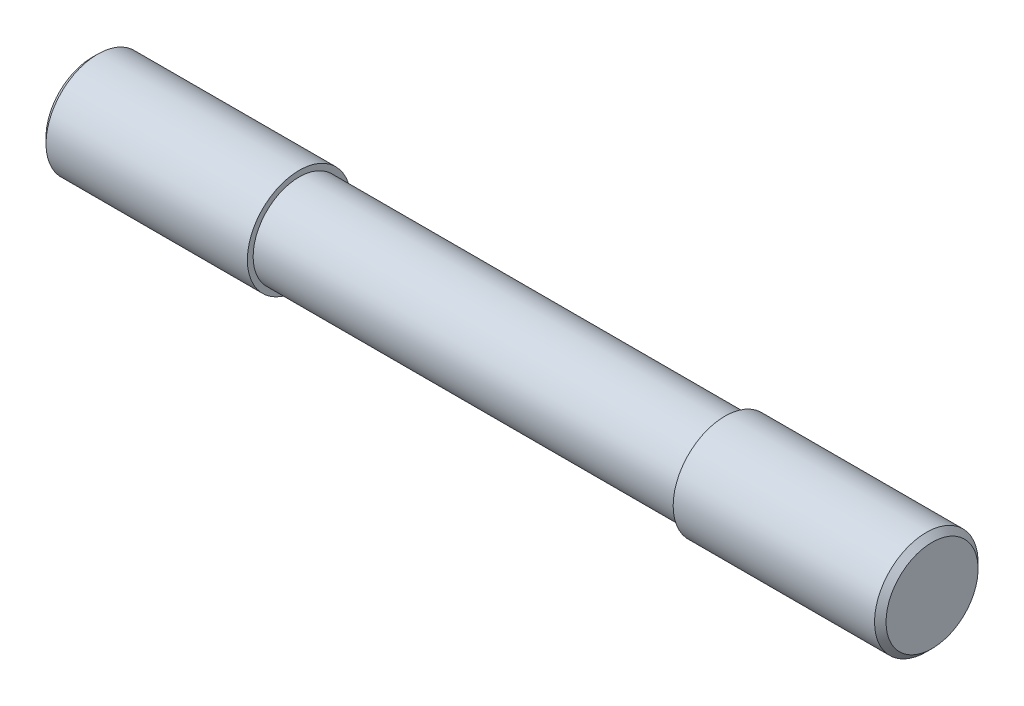
ISO-10303-21;
HEADER;
FILE_DESCRIPTION(('STEP AP214'),'2;1');
FILE_NAME('part.step','',(''),(''),'','','');
FILE_SCHEMA(('AUTOMOTIVE_DESIGN { 1 0 10303 214 1 1 1 1 }'));
ENDSEC;
DATA;
#1=APPLICATION_CONTEXT('core data for automotive mechanical design processes');
#2=APPLICATION_PROTOCOL_DEFINITION('international standard','automotive_design',2000,#1);
#3=PRODUCT_CONTEXT('',#1,'mechanical');
#4=PRODUCT('Part','Part','',(#3));
#5=PRODUCT_RELATED_PRODUCT_CATEGORY('part','',(#4));
#6=PRODUCT_DEFINITION_FORMATION('','',#4);
#7=PRODUCT_DEFINITION_CONTEXT('part definition',#1,'design');
#8=PRODUCT_DEFINITION('design','',#6,#7);
#9=PRODUCT_DEFINITION_SHAPE('','',#8);
#10=(LENGTH_UNIT() NAMED_UNIT(*) SI_UNIT(.MILLI.,.METRE.));
#11=(NAMED_UNIT(*) PLANE_ANGLE_UNIT() SI_UNIT($,.RADIAN.));
#12=(NAMED_UNIT(*) SI_UNIT($,.STERADIAN.) SOLID_ANGLE_UNIT());
#13=UNCERTAINTY_MEASURE_WITH_UNIT(LENGTH_MEASURE(1.E-05),#10,'distance_accuracy_value','');
#14=(GEOMETRIC_REPRESENTATION_CONTEXT(3) GLOBAL_UNCERTAINTY_ASSIGNED_CONTEXT((#13)) GLOBAL_UNIT_ASSIGNED_CONTEXT((#10,
#11,#12)) REPRESENTATION_CONTEXT('',''));
#15=CARTESIAN_POINT('',(0.,0.,0.));
#16=DIRECTION('',(0.,0.,1.));
#17=DIRECTION('',(1.,0.,0.));
#18=AXIS2_PLACEMENT_3D('',#15,#16,#17);
#19=CARTESIAN_POINT('',(365.,0.,0.));
#20=DIRECTION('',(-1.,0.,0.));
#21=DIRECTION('',(0.,0.,1.));
#22=AXIS2_PLACEMENT_3D('',#19,#20,#21);
#23=PLANE('',#22);
#24=CARTESIAN_POINT('',(365.,0.,0.));
#25=DIRECTION('',(-1.,0.,0.));
#26=DIRECTION('',(0.,0.,1.));
#27=AXIS2_PLACEMENT_3D('',#24,#25,#26);
#28=CIRCLE('',#27,19.9999999999999);
#29=CARTESIAN_POINT('',(365.,0.,19.9999999999999));
#30=VERTEX_POINT('',#29);
#31=EDGE_CURVE('E10',#30,#30,#28,.F.);
#32=ORIENTED_EDGE('',*,*,#31,.T.);
#33=EDGE_LOOP('',(#32));
#34=FACE_BOUND('',#33,.T.);
#35=ADVANCED_FACE('F31',(#34),#23,.F.);
#36=CARTESIAN_POINT('',(-60.5841836734694,0.,0.));
#37=DIRECTION('',(-1.,0.,0.));
#38=DIRECTION('',(0.,0.,1.));
#39=AXIS2_PLACEMENT_3D('',#36,#37,#38);
#40=CYLINDRICAL_SURFACE('',#39,22.5);
#41=CARTESIAN_POINT('',(362.5,0.,0.));
#42=DIRECTION('',(-1.,0.,0.));
#43=DIRECTION('',(0.,0.,1.));
#44=AXIS2_PLACEMENT_3D('',#41,#42,#43);
#45=CIRCLE('',#44,22.5);
#46=CARTESIAN_POINT('',(362.5,0.,22.5));
#47=VERTEX_POINT('',#46);
#48=EDGE_CURVE('E38',#47,#47,#45,.T.);
#49=ORIENTED_EDGE('',*,*,#48,.T.);
#50=EDGE_LOOP('',(#49));
#51=FACE_BOUND('',#50,.T.);
#52=CARTESIAN_POINT('',(275.,0.,0.));
#53=DIRECTION('',(-1.,0.,0.));
#54=DIRECTION('',(0.,0.,1.));
#55=AXIS2_PLACEMENT_3D('',#52,#53,#54);
#56=CIRCLE('',#55,22.5);
#57=CARTESIAN_POINT('',(275.,0.,22.5));
#58=VERTEX_POINT('',#57);
#59=EDGE_CURVE('E51',#58,#58,#56,.T.);
#60=ORIENTED_EDGE('',*,*,#59,.F.);
#61=EDGE_LOOP('',(#60));
#62=FACE_BOUND('',#61,.T.);
#63=ADVANCED_FACE('F81',(#51,#62),#40,.T.);
#64=CARTESIAN_POINT('',(275.,0.,-22.5));
#65=DIRECTION('',(1.,0.,0.));
#66=DIRECTION('',(0.,0.,-1.));
#67=AXIS2_PLACEMENT_3D('',#64,#65,#66);
#68=PLANE('',#67);
#69=CARTESIAN_POINT('',(275.,0.,0.));
#70=DIRECTION('',(-1.,0.,0.));
#71=DIRECTION('',(0.,0.,1.));
#72=AXIS2_PLACEMENT_3D('',#69,#70,#71);
#73=CIRCLE('',#72,20.);
#74=CARTESIAN_POINT('',(275.,0.,20.));
#75=VERTEX_POINT('',#74);
#76=EDGE_CURVE('E54',#75,#75,#73,.T.);
#77=ORIENTED_EDGE('',*,*,#76,.F.);
#78=EDGE_LOOP('',(#77));
#79=FACE_BOUND('',#78,.T.);
#80=ORIENTED_EDGE('',*,*,#59,.T.);
#81=EDGE_LOOP('',(#80));
#82=FACE_BOUND('',#81,.T.);
#83=ADVANCED_FACE('F75',(#79,#82),#68,.F.);
#84=CARTESIAN_POINT('',(-60.5841836734694,0.,0.));
#85=DIRECTION('',(-1.,0.,0.));
#86=DIRECTION('',(0.,0.,1.));
#87=AXIS2_PLACEMENT_3D('',#84,#85,#86);
#88=CYLINDRICAL_SURFACE('',#87,20.);
#89=CARTESIAN_POINT('',(90.,0.,0.));
#90=DIRECTION('',(-1.,0.,0.));
#91=DIRECTION('',(0.,0.,1.));
#92=AXIS2_PLACEMENT_3D('',#89,#90,#91);
#93=CIRCLE('',#92,20.);
#94=CARTESIAN_POINT('',(90.,0.,20.));
#95=VERTEX_POINT('',#94);
#96=EDGE_CURVE('E57',#95,#95,#93,.T.);
#97=ORIENTED_EDGE('',*,*,#96,.F.);
#98=EDGE_LOOP('',(#97));
#99=FACE_BOUND('',#98,.T.);
#100=ORIENTED_EDGE('',*,*,#76,.T.);
#101=EDGE_LOOP('',(#100));
#102=FACE_BOUND('',#101,.T.);
#103=ADVANCED_FACE('F69',(#99,#102),#88,.T.);
#104=CARTESIAN_POINT('',(89.9999999999999,0.,-22.5));
#105=DIRECTION('',(-1.,0.,0.));
#106=DIRECTION('',(0.,0.,1.));
#107=AXIS2_PLACEMENT_3D('',#104,#105,#106);
#108=PLANE('',#107);
#109=CARTESIAN_POINT('',(89.9999999999999,0.,0.));
#110=DIRECTION('',(-1.,0.,0.));
#111=DIRECTION('',(0.,0.,1.));
#112=AXIS2_PLACEMENT_3D('',#109,#110,#111);
#113=CIRCLE('',#112,22.5);
#114=CARTESIAN_POINT('',(89.9999999999999,0.,22.5));
#115=VERTEX_POINT('',#114);
#116=EDGE_CURVE('E60',#115,#115,#113,.T.);
#117=ORIENTED_EDGE('',*,*,#116,.F.);
#118=EDGE_LOOP('',(#117));
#119=FACE_BOUND('',#118,.T.);
#120=ORIENTED_EDGE('',*,*,#96,.T.);
#121=EDGE_LOOP('',(#120));
#122=FACE_BOUND('',#121,.T.);
#123=ADVANCED_FACE('F66',(#119,#122),#108,.F.);
#124=CARTESIAN_POINT('',(-60.5841836734694,0.,0.));
#125=DIRECTION('',(-1.,0.,0.));
#126=DIRECTION('',(0.,0.,1.));
#127=AXIS2_PLACEMENT_3D('',#124,#125,#126);
#128=CYLINDRICAL_SURFACE('',#127,22.5);
#129=CARTESIAN_POINT('',(2.49999999999989,0.,0.));
#130=DIRECTION('',(1.,0.,0.));
#131=DIRECTION('',(0.,0.,-1.));
#132=AXIS2_PLACEMENT_3D('',#129,#130,#131);
#133=CIRCLE('',#132,22.5);
#134=CARTESIAN_POINT('',(2.49999999999989,0.,-22.5));
#135=VERTEX_POINT('',#134);
#136=EDGE_CURVE('E42',#135,#135,#133,.T.);
#137=ORIENTED_EDGE('',*,*,#136,.T.);
#138=EDGE_LOOP('',(#137));
#139=FACE_BOUND('',#138,.T.);
#140=ORIENTED_EDGE('',*,*,#116,.T.);
#141=EDGE_LOOP('',(#140));
#142=FACE_BOUND('',#141,.T.);
#143=ADVANCED_FACE('F64',(#139,#142),#128,.T.);
#144=CARTESIAN_POINT('',(0.,0.,0.));
#145=DIRECTION('',(1.,0.,0.));
#146=DIRECTION('',(0.,0.,-1.));
#147=AXIS2_PLACEMENT_3D('',#144,#145,#146);
#148=PLANE('',#147);
#149=CARTESIAN_POINT('',(0.,0.,0.));
#150=DIRECTION('',(1.,0.,0.));
#151=DIRECTION('',(0.,0.,-1.));
#152=AXIS2_PLACEMENT_3D('',#149,#150,#151);
#153=CIRCLE('',#152,20.);
#154=CARTESIAN_POINT('',(0.,0.,-20.));
#155=VERTEX_POINT('',#154);
#156=EDGE_CURVE('E46',#155,#155,#153,.F.);
#157=ORIENTED_EDGE('',*,*,#156,.T.);
#158=EDGE_LOOP('',(#157));
#159=FACE_BOUND('',#158,.T.);
#160=ADVANCED_FACE('F93',(#159),#148,.F.);
#161=CARTESIAN_POINT('',(0.,0.,0.));
#162=DIRECTION('',(1.,0.,0.));
#163=DIRECTION('',(0.,0.,-1.));
#164=AXIS2_PLACEMENT_3D('',#161,#162,#163);
#165=CONICAL_SURFACE('',#164,20.,0.785398163397448);
#166=ORIENTED_EDGE('',*,*,#136,.F.);
#167=EDGE_LOOP('',(#166));
#168=FACE_BOUND('',#167,.T.);
#169=ORIENTED_EDGE('',*,*,#156,.F.);
#170=EDGE_LOOP('',(#169));
#171=FACE_BOUND('',#170,.T.);
#172=ADVANCED_FACE('F91',(#168,#171),#165,.T.);
#173=CARTESIAN_POINT('',(362.5,0.,0.));
#174=DIRECTION('',(-1.,0.,0.));
#175=DIRECTION('',(0.,0.,1.));
#176=AXIS2_PLACEMENT_3D('',#173,#174,#175);
#177=CONICAL_SURFACE('',#176,22.5,0.785398163397454);
#178=ORIENTED_EDGE('',*,*,#31,.F.);
#179=EDGE_LOOP('',(#178));
#180=FACE_BOUND('',#179,.T.);
#181=ORIENTED_EDGE('',*,*,#48,.F.);
#182=EDGE_LOOP('',(#181));
#183=FACE_BOUND('',#182,.T.);
#184=ADVANCED_FACE('F33',(#180,#183),#177,.T.);
#185=CLOSED_SHELL('',(#35,#63,#83,#103,#123,#143,#160,#172,#184));
#186=MANIFOLD_SOLID_BREP('B2',#185);
#187=ADVANCED_BREP_SHAPE_REPRESENTATION('',(#18,#186),#14);
#188=SHAPE_DEFINITION_REPRESENTATION(#9,#187);
ENDSEC;
END-ISO-10303-21;
